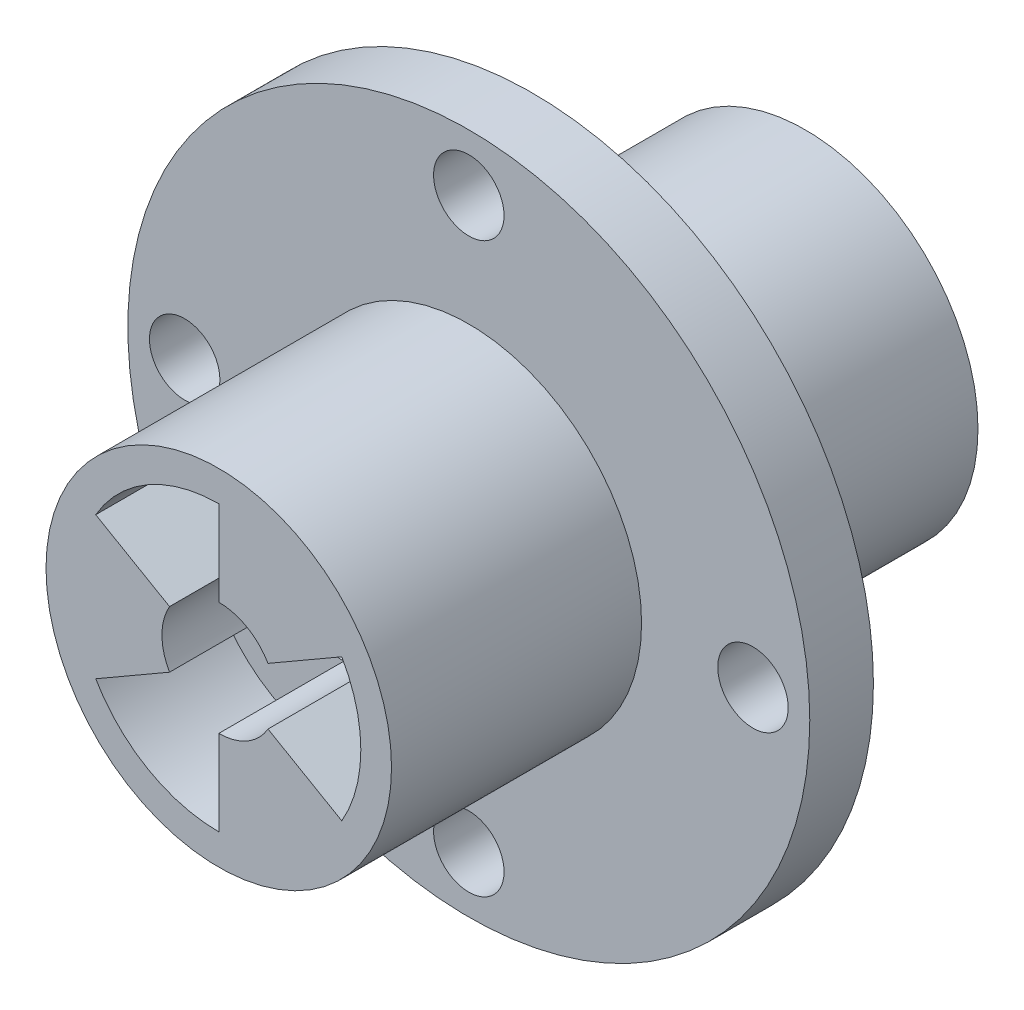
ISO-10303-21;
HEADER;
FILE_DESCRIPTION(('STEP AP214'),'2;1');
FILE_NAME('part.step','',(''),(''),'','','');
FILE_SCHEMA(('AUTOMOTIVE_DESIGN { 1 0 10303 214 1 1 1 1 }'));
ENDSEC;
DATA;
#1=APPLICATION_CONTEXT('core data for automotive mechanical design processes');
#2=APPLICATION_PROTOCOL_DEFINITION('international standard','automotive_design',2000,#1);
#3=PRODUCT_CONTEXT('',#1,'mechanical');
#4=PRODUCT('Part','Part','',(#3));
#5=PRODUCT_RELATED_PRODUCT_CATEGORY('part','',(#4));
#6=PRODUCT_DEFINITION_FORMATION('','',#4);
#7=PRODUCT_DEFINITION_CONTEXT('part definition',#1,'design');
#8=PRODUCT_DEFINITION('design','',#6,#7);
#9=PRODUCT_DEFINITION_SHAPE('','',#8);
#10=(LENGTH_UNIT() NAMED_UNIT(*) SI_UNIT(.MILLI.,.METRE.));
#11=(NAMED_UNIT(*) PLANE_ANGLE_UNIT() SI_UNIT($,.RADIAN.));
#12=(NAMED_UNIT(*) SI_UNIT($,.STERADIAN.) SOLID_ANGLE_UNIT());
#13=UNCERTAINTY_MEASURE_WITH_UNIT(LENGTH_MEASURE(1.E-05),#10,'distance_accuracy_value','');
#14=(GEOMETRIC_REPRESENTATION_CONTEXT(3) GLOBAL_UNCERTAINTY_ASSIGNED_CONTEXT((#13)) GLOBAL_UNIT_ASSIGNED_CONTEXT((#10,
#11,#12)) REPRESENTATION_CONTEXT('',''));
#15=CARTESIAN_POINT('',(0.,0.,0.));
#16=DIRECTION('',(0.,0.,1.));
#17=DIRECTION('',(1.,0.,0.));
#18=AXIS2_PLACEMENT_3D('',#15,#16,#17);
#19=CARTESIAN_POINT('',(0.,0.,0.));
#20=DIRECTION('',(0.,0.,1.));
#21=DIRECTION('',(1.,0.,0.));
#22=AXIS2_PLACEMENT_3D('',#19,#20,#21);
#23=CYLINDRICAL_SURFACE('',#22,2.5);
#24=CARTESIAN_POINT('',(0.,0.,6.3));
#25=DIRECTION('',(0.,0.,1.));
#26=DIRECTION('',(1.,0.,0.));
#27=AXIS2_PLACEMENT_3D('',#24,#25,#26);
#28=CIRCLE('',#27,2.5);
#29=CARTESIAN_POINT('',(2.5,0.,6.3));
#30=VERTEX_POINT('',#29);
#31=EDGE_CURVE('E183',#30,#30,#28,.F.);
#32=ORIENTED_EDGE('',*,*,#31,.T.);
#33=EDGE_LOOP('',(#32));
#34=FACE_BOUND('',#33,.T.);
#35=DIRECTION('',(0.,0.,1.));
#36=VECTOR('',#35,1.);
#37=CARTESIAN_POINT('',(2.1650635094611,-1.25,8.3));
#38=LINE('',#37,#36);
#39=CARTESIAN_POINT('',(2.1650635094611,-1.25,8.3));
#40=VERTEX_POINT('',#39);
#41=CARTESIAN_POINT('',(2.1650635094611,-1.25,13.8));
#42=VERTEX_POINT('',#41);
#43=EDGE_CURVE('E158',#40,#42,#38,.T.);
#44=ORIENTED_EDGE('',*,*,#43,.F.);
#45=CARTESIAN_POINT('',(0.,0.,8.3));
#46=DIRECTION('',(0.,0.,1.));
#47=DIRECTION('',(1.,0.,0.));
#48=AXIS2_PLACEMENT_3D('',#45,#46,#47);
#49=CIRCLE('',#48,2.5);
#50=CARTESIAN_POINT('',(2.1650635094611,1.25,8.3));
#51=VERTEX_POINT('',#50);
#52=EDGE_CURVE('E177',#51,#40,#49,.F.);
#53=ORIENTED_EDGE('',*,*,#52,.F.);
#54=DIRECTION('',(0.,0.,1.));
#55=VECTOR('',#54,1.);
#56=CARTESIAN_POINT('',(2.1650635094611,1.25,8.3));
#57=LINE('',#56,#55);
#58=CARTESIAN_POINT('',(2.1650635094611,1.25,13.8));
#59=VERTEX_POINT('',#58);
#60=EDGE_CURVE('E189',#51,#59,#57,.T.);
#61=ORIENTED_EDGE('',*,*,#60,.T.);
#62=CARTESIAN_POINT('',(0.,0.,13.8));
#63=DIRECTION('',(0.,0.,1.));
#64=DIRECTION('',(1.,0.,0.));
#65=AXIS2_PLACEMENT_3D('',#62,#63,#64);
#66=CIRCLE('',#65,2.5);
#67=CARTESIAN_POINT('',(0.,2.5,13.8));
#68=VERTEX_POINT('',#67);
#69=EDGE_CURVE('E216',#68,#59,#66,.F.);
#70=ORIENTED_EDGE('',*,*,#69,.F.);
#71=DIRECTION('',(0.,0.,1.));
#72=VECTOR('',#71,1.);
#73=CARTESIAN_POINT('',(0.,2.5,8.3));
#74=LINE('',#73,#72);
#75=CARTESIAN_POINT('',(0.,2.5,8.3));
#76=VERTEX_POINT('',#75);
#77=EDGE_CURVE('E214',#76,#68,#74,.T.);
#78=ORIENTED_EDGE('',*,*,#77,.F.);
#79=CARTESIAN_POINT('',(0.,0.,8.3));
#80=DIRECTION('',(0.,0.,1.));
#81=DIRECTION('',(1.,0.,0.));
#82=AXIS2_PLACEMENT_3D('',#79,#80,#81);
#83=CIRCLE('',#82,2.5);
#84=CARTESIAN_POINT('',(-2.1650635094611,1.25,8.3));
#85=VERTEX_POINT('',#84);
#86=EDGE_CURVE('E203',#85,#76,#83,.F.);
#87=ORIENTED_EDGE('',*,*,#86,.F.);
#88=DIRECTION('',(0.,0.,1.));
#89=VECTOR('',#88,1.);
#90=CARTESIAN_POINT('',(-2.1650635094611,1.25,8.3));
#91=LINE('',#90,#89);
#92=CARTESIAN_POINT('',(-2.1650635094611,1.25,13.8));
#93=VERTEX_POINT('',#92);
#94=EDGE_CURVE('E217',#85,#93,#91,.T.);
#95=ORIENTED_EDGE('',*,*,#94,.T.);
#96=CARTESIAN_POINT('',(-2.1650635094611,-1.25,13.8));
#97=VERTEX_POINT('',#96);
#98=EDGE_CURVE('E228',#97,#93,#66,.F.);
#99=ORIENTED_EDGE('',*,*,#98,.F.);
#100=DIRECTION('',(0.,0.,1.));
#101=VECTOR('',#100,1.);
#102=CARTESIAN_POINT('',(-2.1650635094611,-1.25,8.3));
#103=LINE('',#102,#101);
#104=CARTESIAN_POINT('',(-2.1650635094611,-1.25,8.3));
#105=VERTEX_POINT('',#104);
#106=EDGE_CURVE('E162',#105,#97,#103,.T.);
#107=ORIENTED_EDGE('',*,*,#106,.F.);
#108=CARTESIAN_POINT('',(0.,0.,8.3));
#109=DIRECTION('',(0.,0.,1.));
#110=DIRECTION('',(1.,0.,0.));
#111=AXIS2_PLACEMENT_3D('',#108,#109,#110);
#112=CIRCLE('',#111,2.5);
#113=CARTESIAN_POINT('',(0.,-2.5,8.3));
#114=VERTEX_POINT('',#113);
#115=EDGE_CURVE('E137',#114,#105,#112,.F.);
#116=ORIENTED_EDGE('',*,*,#115,.F.);
#117=DIRECTION('',(0.,0.,1.));
#118=VECTOR('',#117,1.);
#119=CARTESIAN_POINT('',(0.,-2.5,8.3));
#120=LINE('',#119,#118);
#121=CARTESIAN_POINT('',(0.,-2.5,13.8));
#122=VERTEX_POINT('',#121);
#123=EDGE_CURVE('E165',#114,#122,#120,.T.);
#124=ORIENTED_EDGE('',*,*,#123,.T.);
#125=EDGE_CURVE('E224',#42,#122,#66,.F.);
#126=ORIENTED_EDGE('',*,*,#125,.F.);
#127=EDGE_LOOP('',(#44,#53,#61,#70,#78,#87,#95,#99,#107,#116,#124,#126));
#128=FACE_BOUND('',#127,.T.);
#129=ADVANCED_FACE('F41',(#34,#128),#23,.F.);
#130=CARTESIAN_POINT('',(0.,0.,-7.));
#131=DIRECTION('',(0.,0.,-1.));
#132=DIRECTION('',(-1.,0.,0.));
#133=AXIS2_PLACEMENT_3D('',#130,#131,#132);
#134=CIRCLE('',#133,2.5);
#135=CARTESIAN_POINT('',(-2.5,0.,-7.));
#136=VERTEX_POINT('',#135);
#137=EDGE_CURVE('E622',#136,#136,#134,.T.);
#138=ORIENTED_EDGE('',*,*,#137,.F.);
#139=EDGE_LOOP('',(#138));
#140=FACE_BOUND('',#139,.T.);
#141=CARTESIAN_POINT('',(0.,0.,-8.));
#142=DIRECTION('',(0.,0.,-1.));
#143=DIRECTION('',(-1.,0.,0.));
#144=AXIS2_PLACEMENT_3D('',#141,#142,#143);
#145=CIRCLE('',#144,2.5);
#146=CARTESIAN_POINT('',(-2.5,0.,-8.));
#147=VERTEX_POINT('',#146);
#148=EDGE_CURVE('E234',#147,#147,#145,.T.);
#149=ORIENTED_EDGE('',*,*,#148,.T.);
#150=EDGE_LOOP('',(#149));
#151=FACE_BOUND('',#150,.T.);
#152=ADVANCED_FACE('F303',(#140,#151),#23,.F.);
#153=CARTESIAN_POINT('',(0.,0.,13.8));
#154=DIRECTION('',(0.,0.,1.));
#155=DIRECTION('',(1.,0.,0.));
#156=AXIS2_PLACEMENT_3D('',#153,#154,#155);
#157=PLANE('',#156);
#158=CARTESIAN_POINT('',(0.,0.,13.8));
#159=DIRECTION('',(0.,0.,1.));
#160=DIRECTION('',(1.,0.,0.));
#161=AXIS2_PLACEMENT_3D('',#158,#159,#160);
#162=CIRCLE('',#161,7.6);
#163=CARTESIAN_POINT('',(7.6,0.,13.8));
#164=VERTEX_POINT('',#163);
#165=EDGE_CURVE('E244',#164,#164,#162,.T.);
#166=ORIENTED_EDGE('',*,*,#165,.T.);
#167=EDGE_LOOP('',(#166));
#168=FACE_BOUND('',#167,.T.);
#169=CARTESIAN_POINT('',(0.,0.,13.8));
#170=DIRECTION('',(0.,0.,1.));
#171=DIRECTION('',(1.,0.,0.));
#172=AXIS2_PLACEMENT_3D('',#169,#170,#171);
#173=CIRCLE('',#172,6.25);
#174=CARTESIAN_POINT('',(5.41265877365274,-3.12500000000001,13.8));
#175=VERTEX_POINT('',#174);
#176=CARTESIAN_POINT('',(5.41265877365274,3.125,13.8));
#177=VERTEX_POINT('',#176);
#178=EDGE_CURVE('E182',#175,#177,#173,.T.);
#179=ORIENTED_EDGE('',*,*,#178,.F.);
#180=DIRECTION('',(-0.866025403784438,0.500000000000001,0.));
#181=VECTOR('',#180,1.);
#182=CARTESIAN_POINT('',(0.,0.,13.8));
#183=LINE('',#182,#181);
#184=EDGE_CURVE('E56',#175,#42,#183,.T.);
#185=ORIENTED_EDGE('',*,*,#184,.T.);
#186=ORIENTED_EDGE('',*,*,#125,.T.);
#187=DIRECTION('',(0.,-1.,0.));
#188=VECTOR('',#187,1.);
#189=CARTESIAN_POINT('',(0.,0.,13.8));
#190=LINE('',#189,#188);
#191=CARTESIAN_POINT('',(0.,-6.25,13.8));
#192=VERTEX_POINT('',#191);
#193=EDGE_CURVE('E146',#122,#192,#190,.T.);
#194=ORIENTED_EDGE('',*,*,#193,.T.);
#195=CARTESIAN_POINT('',(0.,0.,13.8));
#196=DIRECTION('',(0.,0.,1.));
#197=DIRECTION('',(1.,0.,0.));
#198=AXIS2_PLACEMENT_3D('',#195,#196,#197);
#199=CIRCLE('',#198,6.25);
#200=CARTESIAN_POINT('',(-5.41265877365274,-3.125,13.8));
#201=VERTEX_POINT('',#200);
#202=EDGE_CURVE('E157',#201,#192,#199,.T.);
#203=ORIENTED_EDGE('',*,*,#202,.F.);
#204=DIRECTION('',(0.866025403784439,0.499999999999999,0.));
#205=VECTOR('',#204,1.);
#206=CARTESIAN_POINT('',(0.,0.,13.8));
#207=LINE('',#206,#205);
#208=EDGE_CURVE('E64',#201,#97,#207,.T.);
#209=ORIENTED_EDGE('',*,*,#208,.T.);
#210=ORIENTED_EDGE('',*,*,#98,.T.);
#211=DIRECTION('',(-0.866025403784438,0.500000000000001,0.));
#212=VECTOR('',#211,1.);
#213=CARTESIAN_POINT('',(0.,0.,13.8));
#214=LINE('',#213,#212);
#215=CARTESIAN_POINT('',(-5.41265877365274,3.12500000000001,13.8));
#216=VERTEX_POINT('',#215);
#217=EDGE_CURVE('E198',#93,#216,#214,.T.);
#218=ORIENTED_EDGE('',*,*,#217,.T.);
#219=CARTESIAN_POINT('',(0.,0.,13.8));
#220=DIRECTION('',(0.,0.,1.));
#221=DIRECTION('',(1.,0.,0.));
#222=AXIS2_PLACEMENT_3D('',#219,#220,#221);
#223=CIRCLE('',#222,6.25);
#224=CARTESIAN_POINT('',(0.,6.25,13.8));
#225=VERTEX_POINT('',#224);
#226=EDGE_CURVE('E209',#225,#216,#223,.T.);
#227=ORIENTED_EDGE('',*,*,#226,.F.);
#228=DIRECTION('',(0.,-1.,0.));
#229=VECTOR('',#228,1.);
#230=CARTESIAN_POINT('',(0.,0.,13.8));
#231=LINE('',#230,#229);
#232=EDGE_CURVE('E164',#225,#68,#231,.T.);
#233=ORIENTED_EDGE('',*,*,#232,.T.);
#234=ORIENTED_EDGE('',*,*,#69,.T.);
#235=DIRECTION('',(0.866025403784439,0.499999999999999,0.));
#236=VECTOR('',#235,1.);
#237=CARTESIAN_POINT('',(0.,0.,13.8));
#238=LINE('',#237,#236);
#239=EDGE_CURVE('E172',#59,#177,#238,.T.);
#240=ORIENTED_EDGE('',*,*,#239,.T.);
#241=EDGE_LOOP('',(#179,#185,#186,#194,#203,#209,#210,#218,#227,#233,#234,#240));
#242=FACE_BOUND('',#241,.T.);
#243=ADVANCED_FACE('F310',(#168,#242),#157,.T.);
#244=CARTESIAN_POINT('',(0.,0.,2.8));
#245=DIRECTION('',(0.,0.,1.));
#246=DIRECTION('',(1.,0.,0.));
#247=AXIS2_PLACEMENT_3D('',#244,#245,#246);
#248=PLANE('',#247);
#249=CARTESIAN_POINT('',(0.,0.,2.8));
#250=DIRECTION('',(0.,0.,1.));
#251=DIRECTION('',(1.,0.,0.));
#252=AXIS2_PLACEMENT_3D('',#249,#250,#251);
#253=CIRCLE('',#252,7.6);
#254=CARTESIAN_POINT('',(7.6,0.,2.8));
#255=VERTEX_POINT('',#254);
#256=EDGE_CURVE('E243',#255,#255,#253,.T.);
#257=ORIENTED_EDGE('',*,*,#256,.F.);
#258=EDGE_LOOP('',(#257));
#259=FACE_BOUND('',#258,.T.);
#260=CARTESIAN_POINT('',(0.,-12.5,2.8));
#261=DIRECTION('',(0.,0.,1.));
#262=DIRECTION('',(1.,0.,0.));
#263=AXIS2_PLACEMENT_3D('',#260,#261,#262);
#264=CIRCLE('',#263,1.55);
#265=CARTESIAN_POINT('',(1.55,-12.5,2.8));
#266=VERTEX_POINT('',#265);
#267=EDGE_CURVE('E256',#266,#266,#264,.T.);
#268=ORIENTED_EDGE('',*,*,#267,.F.);
#269=EDGE_LOOP('',(#268));
#270=FACE_BOUND('',#269,.T.);
#271=CARTESIAN_POINT('',(0.,12.5,2.8));
#272=DIRECTION('',(0.,0.,1.));
#273=DIRECTION('',(1.,0.,0.));
#274=AXIS2_PLACEMENT_3D('',#271,#272,#273);
#275=CIRCLE('',#274,1.55);
#276=CARTESIAN_POINT('',(1.55,12.5,2.8));
#277=VERTEX_POINT('',#276);
#278=EDGE_CURVE('E268',#277,#277,#275,.T.);
#279=ORIENTED_EDGE('',*,*,#278,.F.);
#280=EDGE_LOOP('',(#279));
#281=FACE_BOUND('',#280,.T.);
#282=CARTESIAN_POINT('',(0.,0.,2.8));
#283=DIRECTION('',(0.,0.,1.));
#284=DIRECTION('',(1.,0.,0.));
#285=AXIS2_PLACEMENT_3D('',#282,#283,#284);
#286=CIRCLE('',#285,15.);
#287=CARTESIAN_POINT('',(15.,0.,2.8));
#288=VERTEX_POINT('',#287);
#289=EDGE_CURVE('E274',#288,#288,#286,.T.);
#290=ORIENTED_EDGE('',*,*,#289,.T.);
#291=EDGE_LOOP('',(#290));
#292=FACE_BOUND('',#291,.T.);
#293=CARTESIAN_POINT('',(12.5,0.,2.8));
#294=DIRECTION('',(0.,0.,1.));
#295=DIRECTION('',(1.,0.,0.));
#296=AXIS2_PLACEMENT_3D('',#293,#294,#295);
#297=CIRCLE('',#296,1.55);
#298=CARTESIAN_POINT('',(14.05,0.,2.8));
#299=VERTEX_POINT('',#298);
#300=EDGE_CURVE('E262',#299,#299,#297,.T.);
#301=ORIENTED_EDGE('',*,*,#300,.F.);
#302=EDGE_LOOP('',(#301));
#303=FACE_BOUND('',#302,.T.);
#304=CARTESIAN_POINT('',(-12.5,0.,2.8));
#305=DIRECTION('',(0.,0.,1.));
#306=DIRECTION('',(1.,0.,0.));
#307=AXIS2_PLACEMENT_3D('',#304,#305,#306);
#308=CIRCLE('',#307,1.55);
#309=CARTESIAN_POINT('',(-10.95,0.,2.8));
#310=VERTEX_POINT('',#309);
#311=EDGE_CURVE('E250',#310,#310,#308,.T.);
#312=ORIENTED_EDGE('',*,*,#311,.F.);
#313=EDGE_LOOP('',(#312));
#314=FACE_BOUND('',#313,.T.);
#315=ADVANCED_FACE('F320',(#259,#270,#281,#292,#303,#314),#248,.T.);
#316=CARTESIAN_POINT('',(0.,0.,0.));
#317=DIRECTION('',(0.,0.,1.));
#318=DIRECTION('',(1.,0.,0.));
#319=AXIS2_PLACEMENT_3D('',#316,#317,#318);
#320=PLANE('',#319);
#321=CARTESIAN_POINT('',(0.,0.,0.));
#322=DIRECTION('',(0.,0.,1.));
#323=DIRECTION('',(1.,0.,0.));
#324=AXIS2_PLACEMENT_3D('',#321,#322,#323);
#325=CIRCLE('',#324,9.25);
#326=CARTESIAN_POINT('',(9.25,0.,0.));
#327=VERTEX_POINT('',#326);
#328=EDGE_CURVE('E12',#327,#327,#325,.T.);
#329=ORIENTED_EDGE('',*,*,#328,.T.);
#330=EDGE_LOOP('',(#329));
#331=FACE_BOUND('',#330,.T.);
#332=CARTESIAN_POINT('',(0.,0.,0.));
#333=DIRECTION('',(0.,0.,1.));
#334=DIRECTION('',(1.,0.,0.));
#335=AXIS2_PLACEMENT_3D('',#332,#333,#334);
#336=CIRCLE('',#335,15.);
#337=CARTESIAN_POINT('',(15.,0.,0.));
#338=VERTEX_POINT('',#337);
#339=EDGE_CURVE('E271',#338,#338,#336,.T.);
#340=ORIENTED_EDGE('',*,*,#339,.F.);
#341=EDGE_LOOP('',(#340));
#342=FACE_BOUND('',#341,.T.);
#343=CARTESIAN_POINT('',(0.,12.5,0.));
#344=DIRECTION('',(0.,0.,1.));
#345=DIRECTION('',(1.,0.,0.));
#346=AXIS2_PLACEMENT_3D('',#343,#344,#345);
#347=CIRCLE('',#346,1.55);
#348=CARTESIAN_POINT('',(1.55,12.5,0.));
#349=VERTEX_POINT('',#348);
#350=EDGE_CURVE('E265',#349,#349,#347,.T.);
#351=ORIENTED_EDGE('',*,*,#350,.T.);
#352=EDGE_LOOP('',(#351));
#353=FACE_BOUND('',#352,.T.);
#354=CARTESIAN_POINT('',(12.5,0.,0.));
#355=DIRECTION('',(0.,0.,1.));
#356=DIRECTION('',(1.,0.,0.));
#357=AXIS2_PLACEMENT_3D('',#354,#355,#356);
#358=CIRCLE('',#357,1.55);
#359=CARTESIAN_POINT('',(14.05,0.,0.));
#360=VERTEX_POINT('',#359);
#361=EDGE_CURVE('E259',#360,#360,#358,.T.);
#362=ORIENTED_EDGE('',*,*,#361,.T.);
#363=EDGE_LOOP('',(#362));
#364=FACE_BOUND('',#363,.T.);
#365=CARTESIAN_POINT('',(0.,-12.5,0.));
#366=DIRECTION('',(0.,0.,1.));
#367=DIRECTION('',(1.,0.,0.));
#368=AXIS2_PLACEMENT_3D('',#365,#366,#367);
#369=CIRCLE('',#368,1.55);
#370=CARTESIAN_POINT('',(1.55,-12.5,0.));
#371=VERTEX_POINT('',#370);
#372=EDGE_CURVE('E253',#371,#371,#369,.T.);
#373=ORIENTED_EDGE('',*,*,#372,.T.);
#374=EDGE_LOOP('',(#373));
#375=FACE_BOUND('',#374,.T.);
#376=CARTESIAN_POINT('',(-12.5,0.,0.));
#377=DIRECTION('',(0.,0.,1.));
#378=DIRECTION('',(1.,0.,0.));
#379=AXIS2_PLACEMENT_3D('',#376,#377,#378);
#380=CIRCLE('',#379,1.55);
#381=CARTESIAN_POINT('',(-10.95,0.,0.));
#382=VERTEX_POINT('',#381);
#383=EDGE_CURVE('E247',#382,#382,#380,.T.);
#384=ORIENTED_EDGE('',*,*,#383,.T.);
#385=EDGE_LOOP('',(#384));
#386=FACE_BOUND('',#385,.T.);
#387=ADVANCED_FACE('F346',(#331,#342,#353,#364,#375,#386),#320,.F.);
#388=CARTESIAN_POINT('',(0.,0.,2.8));
#389=DIRECTION('',(0.,0.,-1.));
#390=DIRECTION('',(-1.,0.,0.));
#391=AXIS2_PLACEMENT_3D('',#388,#389,#390);
#392=CYLINDRICAL_SURFACE('',#391,15.);
#393=ORIENTED_EDGE('',*,*,#289,.F.);
#394=EDGE_LOOP('',(#393));
#395=FACE_BOUND('',#394,.T.);
#396=ORIENTED_EDGE('',*,*,#339,.T.);
#397=EDGE_LOOP('',(#396));
#398=FACE_BOUND('',#397,.T.);
#399=ADVANCED_FACE('F342',(#395,#398),#392,.T.);
#400=CARTESIAN_POINT('',(0.,12.5,2.8));
#401=DIRECTION('',(0.,0.,-1.));
#402=DIRECTION('',(-1.,0.,0.));
#403=AXIS2_PLACEMENT_3D('',#400,#401,#402);
#404=CYLINDRICAL_SURFACE('',#403,1.55);
#405=ORIENTED_EDGE('',*,*,#278,.T.);
#406=EDGE_LOOP('',(#405));
#407=FACE_BOUND('',#406,.T.);
#408=ORIENTED_EDGE('',*,*,#350,.F.);
#409=EDGE_LOOP('',(#408));
#410=FACE_BOUND('',#409,.T.);
#411=ADVANCED_FACE('F338',(#407,#410),#404,.F.);
#412=CARTESIAN_POINT('',(12.5,0.,2.8));
#413=DIRECTION('',(0.,0.,-1.));
#414=DIRECTION('',(-1.,0.,0.));
#415=AXIS2_PLACEMENT_3D('',#412,#413,#414);
#416=CYLINDRICAL_SURFACE('',#415,1.55);
#417=ORIENTED_EDGE('',*,*,#300,.T.);
#418=EDGE_LOOP('',(#417));
#419=FACE_BOUND('',#418,.T.);
#420=ORIENTED_EDGE('',*,*,#361,.F.);
#421=EDGE_LOOP('',(#420));
#422=FACE_BOUND('',#421,.T.);
#423=ADVANCED_FACE('F334',(#419,#422),#416,.F.);
#424=CARTESIAN_POINT('',(0.,-12.5,2.8));
#425=DIRECTION('',(0.,0.,-1.));
#426=DIRECTION('',(-1.,0.,0.));
#427=AXIS2_PLACEMENT_3D('',#424,#425,#426);
#428=CYLINDRICAL_SURFACE('',#427,1.55);
#429=ORIENTED_EDGE('',*,*,#267,.T.);
#430=EDGE_LOOP('',(#429));
#431=FACE_BOUND('',#430,.T.);
#432=ORIENTED_EDGE('',*,*,#372,.F.);
#433=EDGE_LOOP('',(#432));
#434=FACE_BOUND('',#433,.T.);
#435=ADVANCED_FACE('F330',(#431,#434),#428,.F.);
#436=CARTESIAN_POINT('',(-12.5,0.,2.8));
#437=DIRECTION('',(0.,0.,-1.));
#438=DIRECTION('',(-1.,0.,0.));
#439=AXIS2_PLACEMENT_3D('',#436,#437,#438);
#440=CYLINDRICAL_SURFACE('',#439,1.55);
#441=ORIENTED_EDGE('',*,*,#311,.T.);
#442=EDGE_LOOP('',(#441));
#443=FACE_BOUND('',#442,.T.);
#444=ORIENTED_EDGE('',*,*,#383,.F.);
#445=EDGE_LOOP('',(#444));
#446=FACE_BOUND('',#445,.T.);
#447=ADVANCED_FACE('F326',(#443,#446),#440,.F.);
#448=CARTESIAN_POINT('',(0.,0.,13.8));
#449=DIRECTION('',(0.,0.,-1.));
#450=DIRECTION('',(-1.,0.,0.));
#451=AXIS2_PLACEMENT_3D('',#448,#449,#450);
#452=CYLINDRICAL_SURFACE('',#451,7.6);
#453=ORIENTED_EDGE('',*,*,#165,.F.);
#454=EDGE_LOOP('',(#453));
#455=FACE_BOUND('',#454,.T.);
#456=ORIENTED_EDGE('',*,*,#256,.T.);
#457=EDGE_LOOP('',(#456));
#458=FACE_BOUND('',#457,.T.);
#459=ADVANCED_FACE('F322',(#455,#458),#452,.T.);
#460=CARTESIAN_POINT('',(0.,0.,-12.));
#461=DIRECTION('',(0.,0.,-1.));
#462=DIRECTION('',(-1.,0.,0.));
#463=AXIS2_PLACEMENT_3D('',#460,#461,#462);
#464=PLANE('',#463);
#465=CARTESIAN_POINT('',(0.,0.,-12.));
#466=DIRECTION('',(0.,0.,-1.));
#467=DIRECTION('',(-1.,0.,0.));
#468=AXIS2_PLACEMENT_3D('',#465,#466,#467);
#469=CIRCLE('',#468,7.6);
#470=CARTESIAN_POINT('',(-7.6,0.,-12.));
#471=VERTEX_POINT('',#470);
#472=EDGE_CURVE('E240',#471,#471,#469,.T.);
#473=ORIENTED_EDGE('',*,*,#472,.T.);
#474=EDGE_LOOP('',(#473));
#475=FACE_BOUND('',#474,.T.);
#476=CARTESIAN_POINT('',(0.,0.,-12.));
#477=DIRECTION('',(0.,0.,-1.));
#478=DIRECTION('',(-1.,0.,0.));
#479=AXIS2_PLACEMENT_3D('',#476,#477,#478);
#480=CIRCLE('',#479,3.2);
#481=CARTESIAN_POINT('',(-3.2,0.,-12.));
#482=VERTEX_POINT('',#481);
#483=EDGE_CURVE('E237',#482,#482,#480,.T.);
#484=ORIENTED_EDGE('',*,*,#483,.F.);
#485=EDGE_LOOP('',(#484));
#486=FACE_BOUND('',#485,.T.);
#487=ADVANCED_FACE('F325',(#475,#486),#464,.T.);
#488=CARTESIAN_POINT('',(0.,0.,-12.));
#489=DIRECTION('',(0.,0.,1.));
#490=DIRECTION('',(1.,0.,0.));
#491=AXIS2_PLACEMENT_3D('',#488,#489,#490);
#492=CYLINDRICAL_SURFACE('',#491,7.6);
#493=CARTESIAN_POINT('',(0.,0.,-3.));
#494=DIRECTION('',(0.,0.,-1.));
#495=DIRECTION('',(-1.,0.,0.));
#496=AXIS2_PLACEMENT_3D('',#493,#494,#495);
#497=CIRCLE('',#496,7.6);
#498=CARTESIAN_POINT('',(-7.6,0.,-3.));
#499=VERTEX_POINT('',#498);
#500=EDGE_CURVE('E227',#499,#499,#497,.F.);
#501=ORIENTED_EDGE('',*,*,#500,.F.);
#502=EDGE_LOOP('',(#501));
#503=FACE_BOUND('',#502,.T.);
#504=ORIENTED_EDGE('',*,*,#472,.F.);
#505=EDGE_LOOP('',(#504));
#506=FACE_BOUND('',#505,.T.);
#507=ADVANCED_FACE('F316',(#503,#506),#492,.T.);
#508=CARTESIAN_POINT('',(0.,0.,-12.));
#509=DIRECTION('',(0.,0.,1.));
#510=DIRECTION('',(1.,0.,0.));
#511=AXIS2_PLACEMENT_3D('',#508,#509,#510);
#512=CYLINDRICAL_SURFACE('',#511,3.2);
#513=CARTESIAN_POINT('',(0.,0.,-8.));
#514=DIRECTION('',(0.,0.,-1.));
#515=DIRECTION('',(-1.,0.,0.));
#516=AXIS2_PLACEMENT_3D('',#513,#514,#515);
#517=CIRCLE('',#516,3.2);
#518=CARTESIAN_POINT('',(-3.2,0.,-8.));
#519=VERTEX_POINT('',#518);
#520=EDGE_CURVE('E277',#519,#519,#517,.T.);
#521=ORIENTED_EDGE('',*,*,#520,.F.);
#522=EDGE_LOOP('',(#521));
#523=FACE_BOUND('',#522,.T.);
#524=ORIENTED_EDGE('',*,*,#483,.T.);
#525=EDGE_LOOP('',(#524));
#526=FACE_BOUND('',#525,.T.);
#527=ADVANCED_FACE('F411',(#523,#526),#512,.F.);
#528=CARTESIAN_POINT('',(0.,0.,-8.));
#529=DIRECTION('',(0.,0.,-1.));
#530=DIRECTION('',(-1.,0.,0.));
#531=AXIS2_PLACEMENT_3D('',#528,#529,#530);
#532=PLANE('',#531);
#533=ORIENTED_EDGE('',*,*,#148,.F.);
#534=EDGE_LOOP('',(#533));
#535=FACE_BOUND('',#534,.T.);
#536=ORIENTED_EDGE('',*,*,#520,.T.);
#537=EDGE_LOOP('',(#536));
#538=FACE_BOUND('',#537,.T.);
#539=ADVANCED_FACE('F419',(#535,#538),#532,.T.);
#540=CARTESIAN_POINT('',(0.,0.,-3.));
#541=DIRECTION('',(0.,0.,1.));
#542=DIRECTION('',(1.,0.,0.));
#543=AXIS2_PLACEMENT_3D('',#540,#541,#542);
#544=CYLINDRICAL_SURFACE('',#543,8.25);
#545=CARTESIAN_POINT('',(0.,0.,-1.));
#546=DIRECTION('',(0.,0.,1.));
#547=DIRECTION('',(1.,0.,0.));
#548=AXIS2_PLACEMENT_3D('',#545,#546,#547);
#549=CIRCLE('',#548,8.25);
#550=CARTESIAN_POINT('',(8.25,0.,-1.));
#551=VERTEX_POINT('',#550);
#552=EDGE_CURVE('E49',#551,#551,#549,.F.);
#553=ORIENTED_EDGE('',*,*,#552,.T.);
#554=EDGE_LOOP('',(#553));
#555=FACE_BOUND('',#554,.T.);
#556=CARTESIAN_POINT('',(0.,0.,-3.));
#557=DIRECTION('',(0.,0.,-1.));
#558=DIRECTION('',(-1.,0.,0.));
#559=AXIS2_PLACEMENT_3D('',#556,#557,#558);
#560=CIRCLE('',#559,8.25);
#561=CARTESIAN_POINT('',(-8.25,0.,-3.));
#562=VERTEX_POINT('',#561);
#563=EDGE_CURVE('E231',#562,#562,#560,.T.);
#564=ORIENTED_EDGE('',*,*,#563,.F.);
#565=EDGE_LOOP('',(#564));
#566=FACE_BOUND('',#565,.T.);
#567=ADVANCED_FACE('F284',(#555,#566),#544,.T.);
#568=CARTESIAN_POINT('',(0.,0.,-3.));
#569=DIRECTION('',(0.,0.,-1.));
#570=DIRECTION('',(-1.,0.,0.));
#571=AXIS2_PLACEMENT_3D('',#568,#569,#570);
#572=PLANE('',#571);
#573=ORIENTED_EDGE('',*,*,#500,.T.);
#574=EDGE_LOOP('',(#573));
#575=FACE_BOUND('',#574,.T.);
#576=ORIENTED_EDGE('',*,*,#563,.T.);
#577=EDGE_LOOP('',(#576));
#578=FACE_BOUND('',#577,.T.);
#579=ADVANCED_FACE('F289',(#575,#578),#572,.T.);
#580=CARTESIAN_POINT('',(0.,0.,-1.));
#581=DIRECTION('',(0.,0.,1.));
#582=DIRECTION('',(1.,0.,0.));
#583=AXIS2_PLACEMENT_3D('',#580,#581,#582);
#584=TOROIDAL_SURFACE('',#583,9.25,1.);
#585=ORIENTED_EDGE('',*,*,#328,.F.);
#586=EDGE_LOOP('',(#585));
#587=FACE_BOUND('',#586,.T.);
#588=ORIENTED_EDGE('',*,*,#552,.F.);
#589=EDGE_LOOP('',(#588));
#590=FACE_BOUND('',#589,.T.);
#591=ADVANCED_FACE('F43',(#587,#590),#584,.F.);
#592=CARTESIAN_POINT('',(0.,0.,8.3));
#593=DIRECTION('',(-1.,0.,0.));
#594=DIRECTION('',(0.,-1.,0.));
#595=AXIS2_PLACEMENT_3D('',#592,#593,#594);
#596=PLANE('',#595);
#597=ORIENTED_EDGE('',*,*,#232,.F.);
#598=DIRECTION('',(0.,0.,1.));
#599=VECTOR('',#598,1.);
#600=CARTESIAN_POINT('',(0.,6.25,8.3));
#601=LINE('',#600,#599);
#602=CARTESIAN_POINT('',(0.,6.25,8.3));
#603=VERTEX_POINT('',#602);
#604=EDGE_CURVE('E206',#603,#225,#601,.T.);
#605=ORIENTED_EDGE('',*,*,#604,.F.);
#606=DIRECTION('',(0.,-1.,0.));
#607=VECTOR('',#606,1.);
#608=CARTESIAN_POINT('',(0.,0.,8.3));
#609=LINE('',#608,#607);
#610=EDGE_CURVE('E195',#603,#76,#609,.T.);
#611=ORIENTED_EDGE('',*,*,#610,.T.);
#612=ORIENTED_EDGE('',*,*,#77,.T.);
#613=EDGE_LOOP('',(#597,#605,#611,#612));
#614=FACE_BOUND('',#613,.T.);
#615=ADVANCED_FACE('F288',(#614),#596,.T.);
#616=CARTESIAN_POINT('',(0.,0.,8.3));
#617=DIRECTION('',(0.500000000000001,0.866025403784438,0.));
#618=DIRECTION('',(-0.866025403784438,0.500000000000001,0.));
#619=AXIS2_PLACEMENT_3D('',#616,#617,#618);
#620=PLANE('',#619);
#621=ORIENTED_EDGE('',*,*,#217,.F.);
#622=ORIENTED_EDGE('',*,*,#94,.F.);
#623=DIRECTION('',(-0.866025403784438,0.500000000000001,0.));
#624=VECTOR('',#623,1.);
#625=CARTESIAN_POINT('',(0.,0.,8.3));
#626=LINE('',#625,#624);
#627=CARTESIAN_POINT('',(-5.41265877365274,3.12500000000001,8.3));
#628=VERTEX_POINT('',#627);
#629=EDGE_CURVE('E201',#85,#628,#626,.T.);
#630=ORIENTED_EDGE('',*,*,#629,.T.);
#631=DIRECTION('',(0.,0.,1.));
#632=VECTOR('',#631,1.);
#633=CARTESIAN_POINT('',(-5.41265877365274,3.12500000000001,8.3));
#634=LINE('',#633,#632);
#635=EDGE_CURVE('E220',#628,#216,#634,.T.);
#636=ORIENTED_EDGE('',*,*,#635,.T.);
#637=EDGE_LOOP('',(#621,#622,#630,#636));
#638=FACE_BOUND('',#637,.T.);
#639=ADVANCED_FACE('F296',(#638),#620,.T.);
#640=CARTESIAN_POINT('',(0.,0.,8.3));
#641=DIRECTION('',(0.,0.,1.));
#642=DIRECTION('',(1.,0.,0.));
#643=AXIS2_PLACEMENT_3D('',#640,#641,#642);
#644=CYLINDRICAL_SURFACE('',#643,6.25);
#645=ORIENTED_EDGE('',*,*,#226,.T.);
#646=ORIENTED_EDGE('',*,*,#635,.F.);
#647=CARTESIAN_POINT('',(0.,0.,8.3));
#648=DIRECTION('',(0.,0.,1.));
#649=DIRECTION('',(1.,0.,0.));
#650=AXIS2_PLACEMENT_3D('',#647,#648,#649);
#651=CIRCLE('',#650,6.25);
#652=EDGE_CURVE('E197',#603,#628,#651,.T.);
#653=ORIENTED_EDGE('',*,*,#652,.F.);
#654=ORIENTED_EDGE('',*,*,#604,.T.);
#655=EDGE_LOOP('',(#645,#646,#653,#654));
#656=FACE_BOUND('',#655,.T.);
#657=ADVANCED_FACE('F504',(#656),#644,.F.);
#658=CARTESIAN_POINT('',(0.,0.,8.3));
#659=DIRECTION('',(0.,0.,1.));
#660=DIRECTION('',(1.,0.,0.));
#661=AXIS2_PLACEMENT_3D('',#658,#659,#660);
#662=PLANE('',#661);
#663=ORIENTED_EDGE('',*,*,#610,.F.);
#664=ORIENTED_EDGE('',*,*,#652,.T.);
#665=ORIENTED_EDGE('',*,*,#629,.F.);
#666=ORIENTED_EDGE('',*,*,#86,.T.);
#667=EDGE_LOOP('',(#663,#664,#665,#666));
#668=FACE_BOUND('',#667,.T.);
#669=ADVANCED_FACE('F513',(#668),#662,.T.);
#670=CARTESIAN_POINT('',(0.,0.,8.3));
#671=DIRECTION('',(0.499999999999999,-0.866025403784439,0.));
#672=DIRECTION('',(0.866025403784439,0.499999999999999,0.));
#673=AXIS2_PLACEMENT_3D('',#670,#671,#672);
#674=PLANE('',#673);
#675=ORIENTED_EDGE('',*,*,#208,.F.);
#676=DIRECTION('',(0.,0.,1.));
#677=VECTOR('',#676,1.);
#678=CARTESIAN_POINT('',(-5.41265877365274,-3.125,8.3));
#679=LINE('',#678,#677);
#680=CARTESIAN_POINT('',(-5.41265877365274,-3.125,8.3));
#681=VERTEX_POINT('',#680);
#682=EDGE_CURVE('E127',#681,#201,#679,.T.);
#683=ORIENTED_EDGE('',*,*,#682,.F.);
#684=DIRECTION('',(0.866025403784439,0.499999999999999,0.));
#685=VECTOR('',#684,1.);
#686=CARTESIAN_POINT('',(0.,0.,8.3));
#687=LINE('',#686,#685);
#688=EDGE_CURVE('E130',#681,#105,#687,.T.);
#689=ORIENTED_EDGE('',*,*,#688,.T.);
#690=ORIENTED_EDGE('',*,*,#106,.T.);
#691=EDGE_LOOP('',(#675,#683,#689,#690));
#692=FACE_BOUND('',#691,.T.);
#693=ADVANCED_FACE('F129',(#692),#674,.T.);
#694=CARTESIAN_POINT('',(0.,0.,8.3));
#695=DIRECTION('',(-1.,0.,0.));
#696=DIRECTION('',(0.,-1.,0.));
#697=AXIS2_PLACEMENT_3D('',#694,#695,#696);
#698=PLANE('',#697);
#699=ORIENTED_EDGE('',*,*,#193,.F.);
#700=ORIENTED_EDGE('',*,*,#123,.F.);
#701=DIRECTION('',(0.,-1.,0.));
#702=VECTOR('',#701,1.);
#703=CARTESIAN_POINT('',(0.,0.,8.3));
#704=LINE('',#703,#702);
#705=CARTESIAN_POINT('',(0.,-6.25,8.3));
#706=VERTEX_POINT('',#705);
#707=EDGE_CURVE('E150',#114,#706,#704,.T.);
#708=ORIENTED_EDGE('',*,*,#707,.T.);
#709=DIRECTION('',(0.,0.,1.));
#710=VECTOR('',#709,1.);
#711=CARTESIAN_POINT('',(0.,-6.25,8.3));
#712=LINE('',#711,#710);
#713=EDGE_CURVE('E136',#706,#192,#712,.T.);
#714=ORIENTED_EDGE('',*,*,#713,.T.);
#715=EDGE_LOOP('',(#699,#700,#708,#714));
#716=FACE_BOUND('',#715,.T.);
#717=ADVANCED_FACE('F530',(#716),#698,.T.);
#718=CARTESIAN_POINT('',(0.,0.,8.3));
#719=DIRECTION('',(0.,0.,1.));
#720=DIRECTION('',(1.,0.,0.));
#721=AXIS2_PLACEMENT_3D('',#718,#719,#720);
#722=CYLINDRICAL_SURFACE('',#721,6.25);
#723=ORIENTED_EDGE('',*,*,#202,.T.);
#724=ORIENTED_EDGE('',*,*,#713,.F.);
#725=CARTESIAN_POINT('',(0.,0.,8.3));
#726=DIRECTION('',(0.,0.,1.));
#727=DIRECTION('',(1.,0.,0.));
#728=AXIS2_PLACEMENT_3D('',#725,#726,#727);
#729=CIRCLE('',#728,6.25);
#730=EDGE_CURVE('E143',#681,#706,#729,.T.);
#731=ORIENTED_EDGE('',*,*,#730,.F.);
#732=ORIENTED_EDGE('',*,*,#682,.T.);
#733=EDGE_LOOP('',(#723,#724,#731,#732));
#734=FACE_BOUND('',#733,.T.);
#735=ADVANCED_FACE('F149',(#734),#722,.F.);
#736=CARTESIAN_POINT('',(0.,0.,8.3));
#737=DIRECTION('',(0.,0.,1.));
#738=DIRECTION('',(1.,0.,0.));
#739=AXIS2_PLACEMENT_3D('',#736,#737,#738);
#740=PLANE('',#739);
#741=ORIENTED_EDGE('',*,*,#688,.F.);
#742=ORIENTED_EDGE('',*,*,#730,.T.);
#743=ORIENTED_EDGE('',*,*,#707,.F.);
#744=ORIENTED_EDGE('',*,*,#115,.T.);
#745=EDGE_LOOP('',(#741,#742,#743,#744));
#746=FACE_BOUND('',#745,.T.);
#747=ADVANCED_FACE('F141',(#746),#740,.T.);
#748=CARTESIAN_POINT('',(0.,0.,8.3));
#749=DIRECTION('',(0.500000000000001,0.866025403784438,0.));
#750=DIRECTION('',(-0.866025403784438,0.500000000000001,0.));
#751=AXIS2_PLACEMENT_3D('',#748,#749,#750);
#752=PLANE('',#751);
#753=ORIENTED_EDGE('',*,*,#184,.F.);
#754=DIRECTION('',(0.,0.,1.));
#755=VECTOR('',#754,1.);
#756=CARTESIAN_POINT('',(5.41265877365274,-3.12500000000001,8.3));
#757=LINE('',#756,#755);
#758=CARTESIAN_POINT('',(5.41265877365274,-3.12500000000001,8.3));
#759=VERTEX_POINT('',#758);
#760=EDGE_CURVE('E180',#759,#175,#757,.T.);
#761=ORIENTED_EDGE('',*,*,#760,.F.);
#762=DIRECTION('',(-0.866025403784438,0.500000000000001,0.));
#763=VECTOR('',#762,1.);
#764=CARTESIAN_POINT('',(0.,0.,8.3));
#765=LINE('',#764,#763);
#766=EDGE_CURVE('E169',#759,#40,#765,.T.);
#767=ORIENTED_EDGE('',*,*,#766,.T.);
#768=ORIENTED_EDGE('',*,*,#43,.T.);
#769=EDGE_LOOP('',(#753,#761,#767,#768));
#770=FACE_BOUND('',#769,.T.);
#771=ADVANCED_FACE('F553',(#770),#752,.T.);
#772=CARTESIAN_POINT('',(0.,0.,8.3));
#773=DIRECTION('',(0.499999999999999,-0.866025403784439,0.));
#774=DIRECTION('',(0.866025403784439,0.499999999999999,0.));
#775=AXIS2_PLACEMENT_3D('',#772,#773,#774);
#776=PLANE('',#775);
#777=ORIENTED_EDGE('',*,*,#239,.F.);
#778=ORIENTED_EDGE('',*,*,#60,.F.);
#779=DIRECTION('',(0.866025403784439,0.499999999999999,0.));
#780=VECTOR('',#779,1.);
#781=CARTESIAN_POINT('',(0.,0.,8.3));
#782=LINE('',#781,#780);
#783=CARTESIAN_POINT('',(5.41265877365274,3.125,8.3));
#784=VERTEX_POINT('',#783);
#785=EDGE_CURVE('E175',#51,#784,#782,.T.);
#786=ORIENTED_EDGE('',*,*,#785,.T.);
#787=DIRECTION('',(0.,0.,1.));
#788=VECTOR('',#787,1.);
#789=CARTESIAN_POINT('',(5.41265877365274,3.125,8.3));
#790=LINE('',#789,#788);
#791=EDGE_CURVE('E192',#784,#177,#790,.T.);
#792=ORIENTED_EDGE('',*,*,#791,.T.);
#793=EDGE_LOOP('',(#777,#778,#786,#792));
#794=FACE_BOUND('',#793,.T.);
#795=ADVANCED_FACE('F564',(#794),#776,.T.);
#796=CARTESIAN_POINT('',(0.,0.,8.3));
#797=DIRECTION('',(0.,0.,1.));
#798=DIRECTION('',(1.,0.,0.));
#799=AXIS2_PLACEMENT_3D('',#796,#797,#798);
#800=CYLINDRICAL_SURFACE('',#799,6.25);
#801=ORIENTED_EDGE('',*,*,#178,.T.);
#802=ORIENTED_EDGE('',*,*,#791,.F.);
#803=CARTESIAN_POINT('',(0.,0.,8.3));
#804=DIRECTION('',(0.,0.,1.));
#805=DIRECTION('',(1.,0.,0.));
#806=AXIS2_PLACEMENT_3D('',#803,#804,#805);
#807=CIRCLE('',#806,6.25);
#808=EDGE_CURVE('E171',#759,#784,#807,.T.);
#809=ORIENTED_EDGE('',*,*,#808,.F.);
#810=ORIENTED_EDGE('',*,*,#760,.T.);
#811=EDGE_LOOP('',(#801,#802,#809,#810));
#812=FACE_BOUND('',#811,.T.);
#813=ADVANCED_FACE('F572',(#812),#800,.F.);
#814=CARTESIAN_POINT('',(0.,0.,8.3));
#815=DIRECTION('',(0.,0.,1.));
#816=DIRECTION('',(1.,0.,0.));
#817=AXIS2_PLACEMENT_3D('',#814,#815,#816);
#818=PLANE('',#817);
#819=ORIENTED_EDGE('',*,*,#766,.F.);
#820=ORIENTED_EDGE('',*,*,#808,.T.);
#821=ORIENTED_EDGE('',*,*,#785,.F.);
#822=ORIENTED_EDGE('',*,*,#52,.T.);
#823=EDGE_LOOP('',(#819,#820,#821,#822));
#824=FACE_BOUND('',#823,.T.);
#825=ADVANCED_FACE('F581',(#824),#818,.T.);
#826=CARTESIAN_POINT('',(0.,0.,-7.));
#827=DIRECTION('',(0.,0.,-1.));
#828=DIRECTION('',(-1.,0.,0.));
#829=AXIS2_PLACEMENT_3D('',#826,#827,#828);
#830=PLANE('',#829);
#831=ORIENTED_EDGE('',*,*,#137,.T.);
#832=EDGE_LOOP('',(#831));
#833=FACE_BOUND('',#832,.T.);
#834=ADVANCED_FACE('F589',(#833),#830,.T.);
#835=CARTESIAN_POINT('',(0.,0.,6.3));
#836=DIRECTION('',(0.,0.,1.));
#837=DIRECTION('',(1.,0.,0.));
#838=AXIS2_PLACEMENT_3D('',#835,#836,#837);
#839=PLANE('',#838);
#840=ORIENTED_EDGE('',*,*,#31,.F.);
#841=EDGE_LOOP('',(#840));
#842=FACE_BOUND('',#841,.T.);
#843=ADVANCED_FACE('F608',(#842),#839,.T.);
#844=CLOSED_SHELL('',(#129,#152,#243,#315,#387,#399,#411,#423,#435,#447,#459,#487,#507,#527,
#539,#567,#579,#591,#615,#639,#657,#669,#693,#717,#735,#747,#771,#795,#813,#825,#834,#843));
#845=MANIFOLD_SOLID_BREP('B2',#844);
#846=ADVANCED_BREP_SHAPE_REPRESENTATION('',(#18,#845),#14);
#847=SHAPE_DEFINITION_REPRESENTATION(#9,#846);
ENDSEC;
END-ISO-10303-21;
